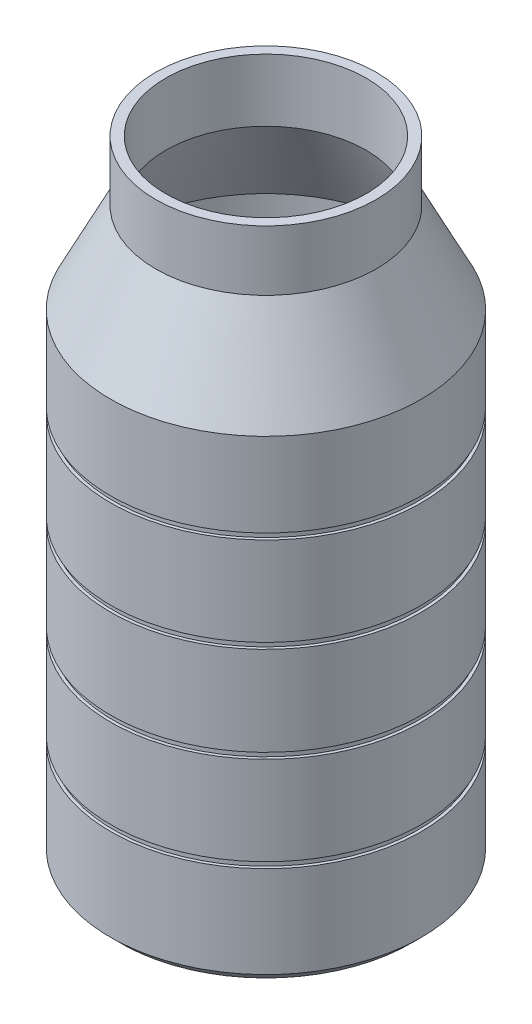
ISO-10303-21;
HEADER;
FILE_DESCRIPTION(('STEP AP214'),'2;1');
FILE_NAME('part.step','',(''),(''),'','','');
FILE_SCHEMA(('AUTOMOTIVE_DESIGN { 1 0 10303 214 1 1 1 1 }'));
ENDSEC;
DATA;
#1=APPLICATION_CONTEXT('core data for automotive mechanical design processes');
#2=APPLICATION_PROTOCOL_DEFINITION('international standard','automotive_design',2000,#1);
#3=PRODUCT_CONTEXT('',#1,'mechanical');
#4=PRODUCT('Part','Part','',(#3));
#5=PRODUCT_RELATED_PRODUCT_CATEGORY('part','',(#4));
#6=PRODUCT_DEFINITION_FORMATION('','',#4);
#7=PRODUCT_DEFINITION_CONTEXT('part definition',#1,'design');
#8=PRODUCT_DEFINITION('design','',#6,#7);
#9=PRODUCT_DEFINITION_SHAPE('','',#8);
#10=(LENGTH_UNIT() NAMED_UNIT(*) SI_UNIT(.MILLI.,.METRE.));
#11=(NAMED_UNIT(*) PLANE_ANGLE_UNIT() SI_UNIT($,.RADIAN.));
#12=(NAMED_UNIT(*) SI_UNIT($,.STERADIAN.) SOLID_ANGLE_UNIT());
#13=UNCERTAINTY_MEASURE_WITH_UNIT(LENGTH_MEASURE(1.E-05),#10,'distance_accuracy_value','');
#14=(GEOMETRIC_REPRESENTATION_CONTEXT(3) GLOBAL_UNCERTAINTY_ASSIGNED_CONTEXT((#13)) GLOBAL_UNIT_ASSIGNED_CONTEXT((#10,
#11,#12)) REPRESENTATION_CONTEXT('',''));
#15=CARTESIAN_POINT('',(0.,0.,0.));
#16=DIRECTION('',(0.,0.,1.));
#17=DIRECTION('',(1.,0.,0.));
#18=AXIS2_PLACEMENT_3D('',#15,#16,#17);
#19=CARTESIAN_POINT('',(0.,0.,0.));
#20=DIRECTION('',(0.,-1.,0.));
#21=DIRECTION('',(0.,0.,-1.));
#22=AXIS2_PLACEMENT_3D('',#19,#20,#21);
#23=PLANE('',#22);
#24=CARTESIAN_POINT('',(0.,0.,0.));
#25=DIRECTION('',(0.,-1.,0.));
#26=DIRECTION('',(0.,0.,-1.));
#27=AXIS2_PLACEMENT_3D('',#24,#25,#26);
#28=CIRCLE('',#27,29.);
#29=CARTESIAN_POINT('',(0.,0.,-29.));
#30=VERTEX_POINT('',#29);
#31=EDGE_CURVE('E10',#30,#30,#28,.T.);
#32=ORIENTED_EDGE('',*,*,#31,.T.);
#33=EDGE_LOOP('',(#32));
#34=FACE_BOUND('',#33,.T.);
#35=ADVANCED_FACE('F41',(#34),#23,.T.);
#36=CARTESIAN_POINT('',(0.,0.,0.));
#37=DIRECTION('',(0.,1.,0.));
#38=DIRECTION('',(0.,0.,1.));
#39=AXIS2_PLACEMENT_3D('',#36,#37,#38);
#40=CONICAL_SURFACE('',#39,29.,0.785398163397448);
#41=CARTESIAN_POINT('',(0.,2.,0.));
#42=DIRECTION('',(0.,-1.,0.));
#43=DIRECTION('',(0.,0.,-1.));
#44=AXIS2_PLACEMENT_3D('',#41,#42,#43);
#45=CIRCLE('',#44,31.);
#46=CARTESIAN_POINT('',(0.,2.,-31.));
#47=VERTEX_POINT('',#46);
#48=EDGE_CURVE('E50',#47,#47,#45,.T.);
#49=ORIENTED_EDGE('',*,*,#48,.T.);
#50=EDGE_LOOP('',(#49));
#51=FACE_BOUND('',#50,.T.);
#52=ORIENTED_EDGE('',*,*,#31,.F.);
#53=EDGE_LOOP('',(#52));
#54=FACE_BOUND('',#53,.T.);
#55=ADVANCED_FACE('F137',(#51,#54),#40,.T.);
#56=CARTESIAN_POINT('',(0.,-10.,0.));
#57=DIRECTION('',(0.,-1.,0.));
#58=DIRECTION('',(0.,0.,-1.));
#59=AXIS2_PLACEMENT_3D('',#56,#57,#58);
#60=CYLINDRICAL_SURFACE('',#59,31.);
#61=CARTESIAN_POINT('',(0.,20.3,0.));
#62=DIRECTION('',(0.,-1.,0.));
#63=DIRECTION('',(0.,0.,-1.));
#64=AXIS2_PLACEMENT_3D('',#61,#62,#63);
#65=CIRCLE('',#64,31.);
#66=CARTESIAN_POINT('',(0.,20.3,-31.));
#67=VERTEX_POINT('',#66);
#68=EDGE_CURVE('E51',#67,#67,#65,.T.);
#69=ORIENTED_EDGE('',*,*,#68,.T.);
#70=EDGE_LOOP('',(#69));
#71=FACE_BOUND('',#70,.T.);
#72=ORIENTED_EDGE('',*,*,#48,.F.);
#73=EDGE_LOOP('',(#72));
#74=FACE_BOUND('',#73,.T.);
#75=ADVANCED_FACE('F138',(#71,#74),#60,.T.);
#76=CARTESIAN_POINT('',(31.,20.3,0.));
#77=DIRECTION('',(0.,1.,0.));
#78=DIRECTION('',(0.,0.,1.));
#79=AXIS2_PLACEMENT_3D('',#76,#77,#78);
#80=PLANE('',#79);
#81=CARTESIAN_POINT('',(0.,20.3,0.));
#82=DIRECTION('',(0.,-1.,0.));
#83=DIRECTION('',(0.,0.,-1.));
#84=AXIS2_PLACEMENT_3D('',#81,#82,#83);
#85=CIRCLE('',#84,30.4);
#86=CARTESIAN_POINT('',(0.,20.3,-30.4));
#87=VERTEX_POINT('',#86);
#88=EDGE_CURVE('E54',#87,#87,#85,.T.);
#89=ORIENTED_EDGE('',*,*,#88,.T.);
#90=EDGE_LOOP('',(#89));
#91=FACE_BOUND('',#90,.T.);
#92=ORIENTED_EDGE('',*,*,#68,.F.);
#93=EDGE_LOOP('',(#92));
#94=FACE_BOUND('',#93,.T.);
#95=ADVANCED_FACE('F145',(#91,#94),#80,.T.);
#96=CARTESIAN_POINT('',(0.,-10.,0.));
#97=DIRECTION('',(0.,-1.,0.));
#98=DIRECTION('',(0.,0.,-1.));
#99=AXIS2_PLACEMENT_3D('',#96,#97,#98);
#100=CYLINDRICAL_SURFACE('',#99,30.4);
#101=CARTESIAN_POINT('',(0.,21.5,0.));
#102=DIRECTION('',(0.,-1.,0.));
#103=DIRECTION('',(0.,0.,-1.));
#104=AXIS2_PLACEMENT_3D('',#101,#102,#103);
#105=CIRCLE('',#104,30.4);
#106=CARTESIAN_POINT('',(0.,21.5,-30.4));
#107=VERTEX_POINT('',#106);
#108=EDGE_CURVE('E58',#107,#107,#105,.T.);
#109=ORIENTED_EDGE('',*,*,#108,.T.);
#110=EDGE_LOOP('',(#109));
#111=FACE_BOUND('',#110,.T.);
#112=ORIENTED_EDGE('',*,*,#88,.F.);
#113=EDGE_LOOP('',(#112));
#114=FACE_BOUND('',#113,.T.);
#115=ADVANCED_FACE('F151',(#111,#114),#100,.T.);
#116=CARTESIAN_POINT('',(30.4,21.5,0.));
#117=DIRECTION('',(0.,-1.,0.));
#118=DIRECTION('',(0.,0.,-1.));
#119=AXIS2_PLACEMENT_3D('',#116,#117,#118);
#120=PLANE('',#119);
#121=CARTESIAN_POINT('',(0.,21.5,0.));
#122=DIRECTION('',(0.,-1.,0.));
#123=DIRECTION('',(0.,0.,-1.));
#124=AXIS2_PLACEMENT_3D('',#121,#122,#123);
#125=CIRCLE('',#124,31.);
#126=CARTESIAN_POINT('',(0.,21.5,-31.));
#127=VERTEX_POINT('',#126);
#128=EDGE_CURVE('E65',#127,#127,#125,.T.);
#129=ORIENTED_EDGE('',*,*,#128,.T.);
#130=EDGE_LOOP('',(#129));
#131=FACE_BOUND('',#130,.T.);
#132=ORIENTED_EDGE('',*,*,#108,.F.);
#133=EDGE_LOOP('',(#132));
#134=FACE_BOUND('',#133,.T.);
#135=ADVANCED_FACE('F154',(#131,#134),#120,.T.);
#136=CARTESIAN_POINT('',(0.,-10.,0.));
#137=DIRECTION('',(0.,-1.,0.));
#138=DIRECTION('',(0.,0.,-1.));
#139=AXIS2_PLACEMENT_3D('',#136,#137,#138);
#140=CYLINDRICAL_SURFACE('',#139,31.);
#141=CARTESIAN_POINT('',(0.,39.2,0.));
#142=DIRECTION('',(0.,-1.,0.));
#143=DIRECTION('',(0.,0.,-1.));
#144=AXIS2_PLACEMENT_3D('',#141,#142,#143);
#145=CIRCLE('',#144,31.);
#146=CARTESIAN_POINT('',(0.,39.2,-31.));
#147=VERTEX_POINT('',#146);
#148=EDGE_CURVE('E67',#147,#147,#145,.T.);
#149=ORIENTED_EDGE('',*,*,#148,.T.);
#150=EDGE_LOOP('',(#149));
#151=FACE_BOUND('',#150,.T.);
#152=ORIENTED_EDGE('',*,*,#128,.F.);
#153=EDGE_LOOP('',(#152));
#154=FACE_BOUND('',#153,.T.);
#155=ADVANCED_FACE('F157',(#151,#154),#140,.T.);
#156=CARTESIAN_POINT('',(31.,39.2,0.));
#157=DIRECTION('',(0.,1.,0.));
#158=DIRECTION('',(0.,0.,1.));
#159=AXIS2_PLACEMENT_3D('',#156,#157,#158);
#160=PLANE('',#159);
#161=CARTESIAN_POINT('',(0.,39.2,0.));
#162=DIRECTION('',(0.,-1.,0.));
#163=DIRECTION('',(0.,0.,-1.));
#164=AXIS2_PLACEMENT_3D('',#161,#162,#163);
#165=CIRCLE('',#164,30.4);
#166=CARTESIAN_POINT('',(0.,39.2,-30.4));
#167=VERTEX_POINT('',#166);
#168=EDGE_CURVE('E66',#167,#167,#165,.T.);
#169=ORIENTED_EDGE('',*,*,#168,.T.);
#170=EDGE_LOOP('',(#169));
#171=FACE_BOUND('',#170,.T.);
#172=ORIENTED_EDGE('',*,*,#148,.F.);
#173=EDGE_LOOP('',(#172));
#174=FACE_BOUND('',#173,.T.);
#175=ADVANCED_FACE('F162',(#171,#174),#160,.T.);
#176=CARTESIAN_POINT('',(0.,-10.,0.));
#177=DIRECTION('',(0.,-1.,0.));
#178=DIRECTION('',(0.,0.,-1.));
#179=AXIS2_PLACEMENT_3D('',#176,#177,#178);
#180=CYLINDRICAL_SURFACE('',#179,30.4);
#181=CARTESIAN_POINT('',(0.,40.4,0.));
#182=DIRECTION('',(0.,-1.,0.));
#183=DIRECTION('',(0.,0.,-1.));
#184=AXIS2_PLACEMENT_3D('',#181,#182,#183);
#185=CIRCLE('',#184,30.4);
#186=CARTESIAN_POINT('',(0.,40.4,-30.4));
#187=VERTEX_POINT('',#186);
#188=EDGE_CURVE('E75',#187,#187,#185,.T.);
#189=ORIENTED_EDGE('',*,*,#188,.T.);
#190=EDGE_LOOP('',(#189));
#191=FACE_BOUND('',#190,.T.);
#192=ORIENTED_EDGE('',*,*,#168,.F.);
#193=EDGE_LOOP('',(#192));
#194=FACE_BOUND('',#193,.T.);
#195=ADVANCED_FACE('F170',(#191,#194),#180,.T.);
#196=CARTESIAN_POINT('',(30.4,40.4,0.));
#197=DIRECTION('',(0.,-1.,0.));
#198=DIRECTION('',(0.,0.,-1.));
#199=AXIS2_PLACEMENT_3D('',#196,#197,#198);
#200=PLANE('',#199);
#201=CARTESIAN_POINT('',(0.,40.4,0.));
#202=DIRECTION('',(0.,-1.,0.));
#203=DIRECTION('',(0.,0.,-1.));
#204=AXIS2_PLACEMENT_3D('',#201,#202,#203);
#205=CIRCLE('',#204,31.);
#206=CARTESIAN_POINT('',(0.,40.4,-31.));
#207=VERTEX_POINT('',#206);
#208=EDGE_CURVE('E73',#207,#207,#205,.T.);
#209=ORIENTED_EDGE('',*,*,#208,.T.);
#210=EDGE_LOOP('',(#209));
#211=FACE_BOUND('',#210,.T.);
#212=ORIENTED_EDGE('',*,*,#188,.F.);
#213=EDGE_LOOP('',(#212));
#214=FACE_BOUND('',#213,.T.);
#215=ADVANCED_FACE('F174',(#211,#214),#200,.T.);
#216=CARTESIAN_POINT('',(0.,-10.,0.));
#217=DIRECTION('',(0.,-1.,0.));
#218=DIRECTION('',(0.,0.,-1.));
#219=AXIS2_PLACEMENT_3D('',#216,#217,#218);
#220=CYLINDRICAL_SURFACE('',#219,31.);
#221=CARTESIAN_POINT('',(0.,58.2,0.));
#222=DIRECTION('',(0.,-1.,0.));
#223=DIRECTION('',(0.,0.,-1.));
#224=AXIS2_PLACEMENT_3D('',#221,#222,#223);
#225=CIRCLE('',#224,31.);
#226=CARTESIAN_POINT('',(0.,58.2,-31.));
#227=VERTEX_POINT('',#226);
#228=EDGE_CURVE('E80',#227,#227,#225,.T.);
#229=ORIENTED_EDGE('',*,*,#228,.T.);
#230=EDGE_LOOP('',(#229));
#231=FACE_BOUND('',#230,.T.);
#232=ORIENTED_EDGE('',*,*,#208,.F.);
#233=EDGE_LOOP('',(#232));
#234=FACE_BOUND('',#233,.T.);
#235=ADVANCED_FACE('F172',(#231,#234),#220,.T.);
#236=CARTESIAN_POINT('',(31.,58.2,0.));
#237=DIRECTION('',(0.,1.,0.));
#238=DIRECTION('',(0.,0.,1.));
#239=AXIS2_PLACEMENT_3D('',#236,#237,#238);
#240=PLANE('',#239);
#241=CARTESIAN_POINT('',(0.,58.2,0.));
#242=DIRECTION('',(0.,-1.,0.));
#243=DIRECTION('',(0.,0.,-1.));
#244=AXIS2_PLACEMENT_3D('',#241,#242,#243);
#245=CIRCLE('',#244,30.4);
#246=CARTESIAN_POINT('',(0.,58.2,-30.4));
#247=VERTEX_POINT('',#246);
#248=EDGE_CURVE('E82',#247,#247,#245,.T.);
#249=ORIENTED_EDGE('',*,*,#248,.T.);
#250=EDGE_LOOP('',(#249));
#251=FACE_BOUND('',#250,.T.);
#252=ORIENTED_EDGE('',*,*,#228,.F.);
#253=EDGE_LOOP('',(#252));
#254=FACE_BOUND('',#253,.T.);
#255=ADVANCED_FACE('F176',(#251,#254),#240,.T.);
#256=CARTESIAN_POINT('',(0.,-10.,0.));
#257=DIRECTION('',(0.,-1.,0.));
#258=DIRECTION('',(0.,0.,-1.));
#259=AXIS2_PLACEMENT_3D('',#256,#257,#258);
#260=CYLINDRICAL_SURFACE('',#259,30.4);
#261=CARTESIAN_POINT('',(0.,59.4,0.));
#262=DIRECTION('',(0.,-1.,0.));
#263=DIRECTION('',(0.,0.,-1.));
#264=AXIS2_PLACEMENT_3D('',#261,#262,#263);
#265=CIRCLE('',#264,30.4);
#266=CARTESIAN_POINT('',(0.,59.4,-30.4));
#267=VERTEX_POINT('',#266);
#268=EDGE_CURVE('E81',#267,#267,#265,.T.);
#269=ORIENTED_EDGE('',*,*,#268,.T.);
#270=EDGE_LOOP('',(#269));
#271=FACE_BOUND('',#270,.T.);
#272=ORIENTED_EDGE('',*,*,#248,.F.);
#273=EDGE_LOOP('',(#272));
#274=FACE_BOUND('',#273,.T.);
#275=ADVANCED_FACE('F181',(#271,#274),#260,.T.);
#276=CARTESIAN_POINT('',(30.4,59.4,0.));
#277=DIRECTION('',(0.,-1.,0.));
#278=DIRECTION('',(0.,0.,-1.));
#279=AXIS2_PLACEMENT_3D('',#276,#277,#278);
#280=PLANE('',#279);
#281=CARTESIAN_POINT('',(0.,59.4,0.));
#282=DIRECTION('',(0.,-1.,0.));
#283=DIRECTION('',(0.,0.,-1.));
#284=AXIS2_PLACEMENT_3D('',#281,#282,#283);
#285=CIRCLE('',#284,31.);
#286=CARTESIAN_POINT('',(0.,59.4,-31.));
#287=VERTEX_POINT('',#286);
#288=EDGE_CURVE('E87',#287,#287,#285,.T.);
#289=ORIENTED_EDGE('',*,*,#288,.T.);
#290=EDGE_LOOP('',(#289));
#291=FACE_BOUND('',#290,.T.);
#292=ORIENTED_EDGE('',*,*,#268,.F.);
#293=EDGE_LOOP('',(#292));
#294=FACE_BOUND('',#293,.T.);
#295=ADVANCED_FACE('F186',(#291,#294),#280,.T.);
#296=CARTESIAN_POINT('',(0.,-10.,0.));
#297=DIRECTION('',(0.,-1.,0.));
#298=DIRECTION('',(0.,0.,-1.));
#299=AXIS2_PLACEMENT_3D('',#296,#297,#298);
#300=CYLINDRICAL_SURFACE('',#299,31.);
#301=CARTESIAN_POINT('',(0.,77.1,0.));
#302=DIRECTION('',(0.,-1.,0.));
#303=DIRECTION('',(0.,0.,-1.));
#304=AXIS2_PLACEMENT_3D('',#301,#302,#303);
#305=CIRCLE('',#304,31.);
#306=CARTESIAN_POINT('',(0.,77.1,-31.));
#307=VERTEX_POINT('',#306);
#308=EDGE_CURVE('E89',#307,#307,#305,.T.);
#309=ORIENTED_EDGE('',*,*,#308,.T.);
#310=EDGE_LOOP('',(#309));
#311=FACE_BOUND('',#310,.T.);
#312=ORIENTED_EDGE('',*,*,#288,.F.);
#313=EDGE_LOOP('',(#312));
#314=FACE_BOUND('',#313,.T.);
#315=ADVANCED_FACE('F192',(#311,#314),#300,.T.);
#316=CARTESIAN_POINT('',(31.,77.1,0.));
#317=DIRECTION('',(0.,1.,0.));
#318=DIRECTION('',(0.,0.,1.));
#319=AXIS2_PLACEMENT_3D('',#316,#317,#318);
#320=PLANE('',#319);
#321=CARTESIAN_POINT('',(0.,77.1,0.));
#322=DIRECTION('',(0.,-1.,0.));
#323=DIRECTION('',(0.,0.,-1.));
#324=AXIS2_PLACEMENT_3D('',#321,#322,#323);
#325=CIRCLE('',#324,30.4);
#326=CARTESIAN_POINT('',(0.,77.1,-30.4));
#327=VERTEX_POINT('',#326);
#328=EDGE_CURVE('E91',#327,#327,#325,.T.);
#329=ORIENTED_EDGE('',*,*,#328,.T.);
#330=EDGE_LOOP('',(#329));
#331=FACE_BOUND('',#330,.T.);
#332=ORIENTED_EDGE('',*,*,#308,.F.);
#333=EDGE_LOOP('',(#332));
#334=FACE_BOUND('',#333,.T.);
#335=ADVANCED_FACE('F193',(#331,#334),#320,.T.);
#336=CARTESIAN_POINT('',(0.,-10.,0.));
#337=DIRECTION('',(0.,-1.,0.));
#338=DIRECTION('',(0.,0.,-1.));
#339=AXIS2_PLACEMENT_3D('',#336,#337,#338);
#340=CYLINDRICAL_SURFACE('',#339,30.4);
#341=CARTESIAN_POINT('',(0.,78.3,0.));
#342=DIRECTION('',(0.,-1.,0.));
#343=DIRECTION('',(0.,0.,-1.));
#344=AXIS2_PLACEMENT_3D('',#341,#342,#343);
#345=CIRCLE('',#344,30.4);
#346=CARTESIAN_POINT('',(0.,78.3,-30.4));
#347=VERTEX_POINT('',#346);
#348=EDGE_CURVE('E96',#347,#347,#345,.T.);
#349=ORIENTED_EDGE('',*,*,#348,.T.);
#350=EDGE_LOOP('',(#349));
#351=FACE_BOUND('',#350,.T.);
#352=ORIENTED_EDGE('',*,*,#328,.F.);
#353=EDGE_LOOP('',(#352));
#354=FACE_BOUND('',#353,.T.);
#355=ADVANCED_FACE('F200',(#351,#354),#340,.T.);
#356=CARTESIAN_POINT('',(30.4,78.3,0.));
#357=DIRECTION('',(0.,-1.,0.));
#358=DIRECTION('',(0.,0.,-1.));
#359=AXIS2_PLACEMENT_3D('',#356,#357,#358);
#360=PLANE('',#359);
#361=CARTESIAN_POINT('',(0.,78.3,0.));
#362=DIRECTION('',(0.,-1.,0.));
#363=DIRECTION('',(0.,0.,-1.));
#364=AXIS2_PLACEMENT_3D('',#361,#362,#363);
#365=CIRCLE('',#364,31.);
#366=CARTESIAN_POINT('',(0.,78.3,-31.));
#367=VERTEX_POINT('',#366);
#368=EDGE_CURVE('E97',#367,#367,#365,.T.);
#369=ORIENTED_EDGE('',*,*,#368,.T.);
#370=EDGE_LOOP('',(#369));
#371=FACE_BOUND('',#370,.T.);
#372=ORIENTED_EDGE('',*,*,#348,.F.);
#373=EDGE_LOOP('',(#372));
#374=FACE_BOUND('',#373,.T.);
#375=ADVANCED_FACE('F201',(#371,#374),#360,.T.);
#376=CARTESIAN_POINT('',(0.,-10.,0.));
#377=DIRECTION('',(0.,-1.,0.));
#378=DIRECTION('',(0.,0.,-1.));
#379=AXIS2_PLACEMENT_3D('',#376,#377,#378);
#380=CYLINDRICAL_SURFACE('',#379,31.);
#381=CARTESIAN_POINT('',(0.,95.,0.));
#382=DIRECTION('',(0.,-1.,0.));
#383=DIRECTION('',(0.,0.,-1.));
#384=AXIS2_PLACEMENT_3D('',#381,#382,#383);
#385=CIRCLE('',#384,31.);
#386=CARTESIAN_POINT('',(0.,95.,-31.));
#387=VERTEX_POINT('',#386);
#388=EDGE_CURVE('E105',#387,#387,#385,.T.);
#389=ORIENTED_EDGE('',*,*,#388,.T.);
#390=EDGE_LOOP('',(#389));
#391=FACE_BOUND('',#390,.T.);
#392=ORIENTED_EDGE('',*,*,#368,.F.);
#393=EDGE_LOOP('',(#392));
#394=FACE_BOUND('',#393,.T.);
#395=ADVANCED_FACE('F210',(#391,#394),#380,.T.);
#396=CARTESIAN_POINT('',(0.,95.,0.));
#397=DIRECTION('',(0.,-1.,0.));
#398=DIRECTION('',(0.,0.,-1.));
#399=AXIS2_PLACEMENT_3D('',#396,#397,#398);
#400=CONICAL_SURFACE('',#399,31.,0.463647609000806);
#401=CARTESIAN_POINT('',(0.,113.,0.));
#402=DIRECTION('',(0.,-1.,0.));
#403=DIRECTION('',(0.,0.,-1.));
#404=AXIS2_PLACEMENT_3D('',#401,#402,#403);
#405=CIRCLE('',#404,22.);
#406=CARTESIAN_POINT('',(0.,113.,-22.));
#407=VERTEX_POINT('',#406);
#408=EDGE_CURVE('E104',#407,#407,#405,.T.);
#409=ORIENTED_EDGE('',*,*,#408,.T.);
#410=EDGE_LOOP('',(#409));
#411=FACE_BOUND('',#410,.T.);
#412=ORIENTED_EDGE('',*,*,#388,.F.);
#413=EDGE_LOOP('',(#412));
#414=FACE_BOUND('',#413,.T.);
#415=ADVANCED_FACE('F211',(#411,#414),#400,.T.);
#416=CARTESIAN_POINT('',(0.,-10.,0.));
#417=DIRECTION('',(0.,-1.,0.));
#418=DIRECTION('',(0.,0.,-1.));
#419=AXIS2_PLACEMENT_3D('',#416,#417,#418);
#420=CYLINDRICAL_SURFACE('',#419,22.);
#421=CARTESIAN_POINT('',(0.,125.,0.));
#422=DIRECTION('',(0.,-1.,0.));
#423=DIRECTION('',(0.,0.,-1.));
#424=AXIS2_PLACEMENT_3D('',#421,#422,#423);
#425=CIRCLE('',#424,22.);
#426=CARTESIAN_POINT('',(0.,125.,-22.));
#427=VERTEX_POINT('',#426);
#428=EDGE_CURVE('E107',#427,#427,#425,.T.);
#429=ORIENTED_EDGE('',*,*,#428,.T.);
#430=EDGE_LOOP('',(#429));
#431=FACE_BOUND('',#430,.T.);
#432=ORIENTED_EDGE('',*,*,#408,.F.);
#433=EDGE_LOOP('',(#432));
#434=FACE_BOUND('',#433,.T.);
#435=ADVANCED_FACE('F214',(#431,#434),#420,.T.);
#436=CARTESIAN_POINT('',(22.,125.,0.));
#437=DIRECTION('',(0.,1.,0.));
#438=DIRECTION('',(0.,0.,1.));
#439=AXIS2_PLACEMENT_3D('',#436,#437,#438);
#440=PLANE('',#439);
#441=CARTESIAN_POINT('',(0.,125.,0.));
#442=DIRECTION('',(0.,-1.,0.));
#443=DIRECTION('',(0.,0.,-1.));
#444=AXIS2_PLACEMENT_3D('',#441,#442,#443);
#445=CIRCLE('',#444,20.);
#446=CARTESIAN_POINT('',(0.,125.,-20.));
#447=VERTEX_POINT('',#446);
#448=EDGE_CURVE('E112',#447,#447,#445,.T.);
#449=ORIENTED_EDGE('',*,*,#448,.T.);
#450=EDGE_LOOP('',(#449));
#451=FACE_BOUND('',#450,.T.);
#452=ORIENTED_EDGE('',*,*,#428,.F.);
#453=EDGE_LOOP('',(#452));
#454=FACE_BOUND('',#453,.T.);
#455=ADVANCED_FACE('F218',(#451,#454),#440,.T.);
#456=CARTESIAN_POINT('',(0.,-10.,0.));
#457=DIRECTION('',(0.,-1.,0.));
#458=DIRECTION('',(0.,0.,-1.));
#459=AXIS2_PLACEMENT_3D('',#456,#457,#458);
#460=CYLINDRICAL_SURFACE('',#459,20.);
#461=CARTESIAN_POINT('',(0.,112.53,0.));
#462=DIRECTION('',(0.,-1.,0.));
#463=DIRECTION('',(0.,0.,-1.));
#464=AXIS2_PLACEMENT_3D('',#461,#462,#463);
#465=CIRCLE('',#464,20.);
#466=CARTESIAN_POINT('',(0.,112.53,-20.));
#467=VERTEX_POINT('',#466);
#468=EDGE_CURVE('E111',#467,#467,#465,.T.);
#469=ORIENTED_EDGE('',*,*,#468,.T.);
#470=EDGE_LOOP('',(#469));
#471=FACE_BOUND('',#470,.T.);
#472=ORIENTED_EDGE('',*,*,#448,.F.);
#473=EDGE_LOOP('',(#472));
#474=FACE_BOUND('',#473,.T.);
#475=ADVANCED_FACE('F224',(#471,#474),#460,.F.);
#476=CARTESIAN_POINT('',(0.,112.53,0.));
#477=DIRECTION('',(0.,-1.,0.));
#478=DIRECTION('',(0.,0.,-1.));
#479=AXIS2_PLACEMENT_3D('',#476,#477,#478);
#480=CONICAL_SURFACE('',#479,20.,0.463647609000806);
#481=CARTESIAN_POINT('',(0.,94.53,0.));
#482=DIRECTION('',(0.,-1.,0.));
#483=DIRECTION('',(0.,0.,-1.));
#484=AXIS2_PLACEMENT_3D('',#481,#482,#483);
#485=CIRCLE('',#484,29.);
#486=CARTESIAN_POINT('',(0.,94.53,-29.));
#487=VERTEX_POINT('',#486);
#488=EDGE_CURVE('E116',#487,#487,#485,.T.);
#489=ORIENTED_EDGE('',*,*,#488,.T.);
#490=EDGE_LOOP('',(#489));
#491=FACE_BOUND('',#490,.T.);
#492=ORIENTED_EDGE('',*,*,#468,.F.);
#493=EDGE_LOOP('',(#492));
#494=FACE_BOUND('',#493,.T.);
#495=ADVANCED_FACE('F135',(#491,#494),#480,.F.);
#496=CARTESIAN_POINT('',(0.,-10.,0.));
#497=DIRECTION('',(0.,-1.,0.));
#498=DIRECTION('',(0.,0.,-1.));
#499=AXIS2_PLACEMENT_3D('',#496,#497,#498);
#500=CYLINDRICAL_SURFACE('',#499,29.);
#501=CARTESIAN_POINT('',(0.,2.,0.));
#502=DIRECTION('',(0.,-1.,0.));
#503=DIRECTION('',(0.,0.,-1.));
#504=AXIS2_PLACEMENT_3D('',#501,#502,#503);
#505=CIRCLE('',#504,29.);
#506=CARTESIAN_POINT('',(0.,2.,-29.));
#507=VERTEX_POINT('',#506);
#508=EDGE_CURVE('E117',#507,#507,#505,.T.);
#509=ORIENTED_EDGE('',*,*,#508,.T.);
#510=EDGE_LOOP('',(#509));
#511=FACE_BOUND('',#510,.T.);
#512=ORIENTED_EDGE('',*,*,#488,.F.);
#513=EDGE_LOOP('',(#512));
#514=FACE_BOUND('',#513,.T.);
#515=ADVANCED_FACE('F121',(#511,#514),#500,.F.);
#516=CARTESIAN_POINT('',(29.,2.,0.));
#517=DIRECTION('',(0.,1.,0.));
#518=DIRECTION('',(0.,0.,1.));
#519=AXIS2_PLACEMENT_3D('',#516,#517,#518);
#520=PLANE('',#519);
#521=ORIENTED_EDGE('',*,*,#508,.F.);
#522=EDGE_LOOP('',(#521));
#523=FACE_BOUND('',#522,.T.);
#524=ADVANCED_FACE('F130',(#523),#520,.T.);
#525=CLOSED_SHELL('',(#35,#55,#75,#95,#115,#135,#155,#175,#195,#215,#235,#255,#275,#295,#315,
#335,#355,#375,#395,#415,#435,#455,#475,#495,#515,#524));
#526=MANIFOLD_SOLID_BREP('B2',#525);
#527=ADVANCED_BREP_SHAPE_REPRESENTATION('',(#18,#526),#14);
#528=SHAPE_DEFINITION_REPRESENTATION(#9,#527);
ENDSEC;
END-ISO-10303-21;
